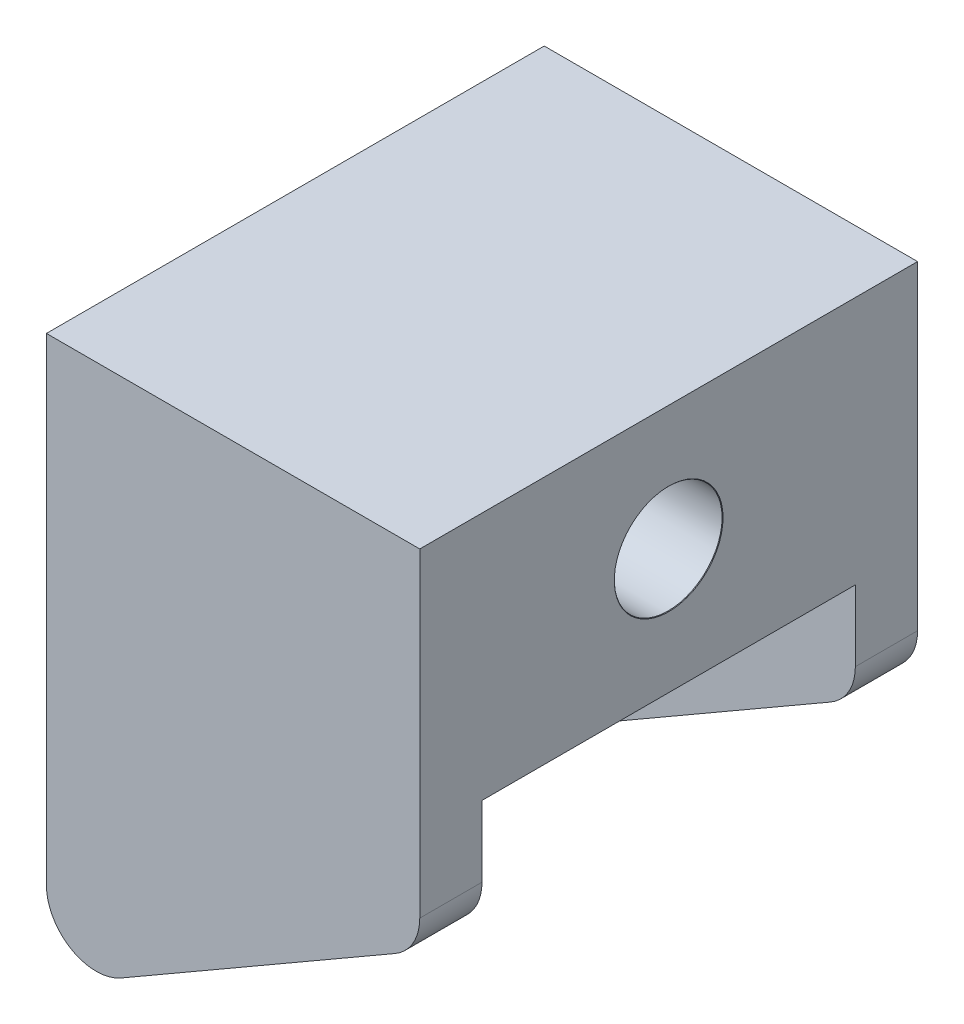
ISO-10303-21;
HEADER;
FILE_DESCRIPTION(('STEP AP214'),'2;1');
FILE_NAME('part.step','',(''),(''),'','','');
FILE_SCHEMA(('AUTOMOTIVE_DESIGN { 1 0 10303 214 1 1 1 1 }'));
ENDSEC;
DATA;
#1=APPLICATION_CONTEXT('core data for automotive mechanical design processes');
#2=APPLICATION_PROTOCOL_DEFINITION('international standard','automotive_design',2000,#1);
#3=PRODUCT_CONTEXT('',#1,'mechanical');
#4=PRODUCT('Part','Part','',(#3));
#5=PRODUCT_RELATED_PRODUCT_CATEGORY('part','',(#4));
#6=PRODUCT_DEFINITION_FORMATION('','',#4);
#7=PRODUCT_DEFINITION_CONTEXT('part definition',#1,'design');
#8=PRODUCT_DEFINITION('design','',#6,#7);
#9=PRODUCT_DEFINITION_SHAPE('','',#8);
#10=(LENGTH_UNIT() NAMED_UNIT(*) SI_UNIT(.MILLI.,.METRE.));
#11=(NAMED_UNIT(*) PLANE_ANGLE_UNIT() SI_UNIT($,.RADIAN.));
#12=(NAMED_UNIT(*) SI_UNIT($,.STERADIAN.) SOLID_ANGLE_UNIT());
#13=UNCERTAINTY_MEASURE_WITH_UNIT(LENGTH_MEASURE(1.E-05),#10,'distance_accuracy_value','');
#14=(GEOMETRIC_REPRESENTATION_CONTEXT(3) GLOBAL_UNCERTAINTY_ASSIGNED_CONTEXT((#13)) GLOBAL_UNIT_ASSIGNED_CONTEXT((#10,
#11,#12)) REPRESENTATION_CONTEXT('',''));
#15=CARTESIAN_POINT('',(0.,0.,0.));
#16=DIRECTION('',(0.,0.,1.));
#17=DIRECTION('',(1.,0.,0.));
#18=AXIS2_PLACEMENT_3D('',#15,#16,#17);
#19=CARTESIAN_POINT('',(45.085,-15.875,0.));
#20=DIRECTION('',(1.,0.,0.));
#21=DIRECTION('',(0.,0.,-1.));
#22=AXIS2_PLACEMENT_3D('',#19,#20,#21);
#23=CYLINDRICAL_SURFACE('',#22,2.74999999999998);
#24=CARTESIAN_POINT('',(45.06,-15.875,0.));
#25=DIRECTION('',(1.,0.,0.));
#26=DIRECTION('',(0.,0.,-1.));
#27=AXIS2_PLACEMENT_3D('',#24,#25,#26);
#28=CIRCLE('',#27,2.74999999999999);
#29=CARTESIAN_POINT('',(45.06,-15.875,-2.74999999999999));
#30=VERTEX_POINT('',#29);
#31=EDGE_CURVE('E293',#30,#30,#28,.T.);
#32=ORIENTED_EDGE('',*,*,#31,.T.);
#33=EDGE_LOOP('',(#32));
#34=FACE_BOUND('',#33,.T.);
#35=CARTESIAN_POINT('',(36.035,-15.875,0.));
#36=DIRECTION('',(-1.,0.,0.));
#37=DIRECTION('',(0.,-1.,0.));
#38=AXIS2_PLACEMENT_3D('',#35,#36,#37);
#39=CIRCLE('',#38,2.74999999999998);
#40=CARTESIAN_POINT('',(36.035,-18.625,0.));
#41=VERTEX_POINT('',#40);
#42=EDGE_CURVE('E239',#41,#41,#39,.F.);
#43=ORIENTED_EDGE('',*,*,#42,.F.);
#44=EDGE_LOOP('',(#43));
#45=FACE_BOUND('',#44,.T.);
#46=ADVANCED_FACE('F47',(#34,#45),#23,.F.);
#47=CARTESIAN_POINT('',(26.035,-33.2235226280624,12.7));
#48=DIRECTION('',(-0.500000000000001,0.866025403784438,0.));
#49=DIRECTION('',(-0.866025403784438,-0.500000000000001,0.));
#50=AXIS2_PLACEMENT_3D('',#47,#48,#49);
#51=PLANE('',#50);
#52=DIRECTION('',(0.866025403784438,0.500000000000001,0.));
#53=VECTOR('',#52,1.);
#54=CARTESIAN_POINT('',(26.035,-33.2235226280624,9.525));
#55=LINE('',#54,#53);
#56=CARTESIAN_POINT('',(26.035,-33.2235226280624,9.525));
#57=VERTEX_POINT('',#56);
#58=CARTESIAN_POINT('',(45.085,-22.225,9.525));
#59=VERTEX_POINT('',#58);
#60=EDGE_CURVE('E258',#57,#59,#55,.T.);
#61=ORIENTED_EDGE('',*,*,#60,.F.);
#62=DIRECTION('',(0.,0.,-1.));
#63=VECTOR('',#62,1.);
#64=CARTESIAN_POINT('',(26.035,-33.2235226280624,12.7));
#65=LINE('',#64,#63);
#66=CARTESIAN_POINT('',(26.035,-33.2235226280624,-9.525));
#67=VERTEX_POINT('',#66);
#68=EDGE_CURVE('E329',#57,#67,#65,.T.);
#69=ORIENTED_EDGE('',*,*,#68,.T.);
#70=DIRECTION('',(0.866025403784438,0.500000000000001,0.));
#71=VECTOR('',#70,1.);
#72=CARTESIAN_POINT('',(26.035,-33.2235226280624,-9.525));
#73=LINE('',#72,#71);
#74=CARTESIAN_POINT('',(45.085,-22.225,-9.525));
#75=VERTEX_POINT('',#74);
#76=EDGE_CURVE('E271',#67,#75,#73,.T.);
#77=ORIENTED_EDGE('',*,*,#76,.T.);
#78=DIRECTION('',(0.,0.,-1.));
#79=VECTOR('',#78,1.);
#80=CARTESIAN_POINT('',(45.085,-22.225,12.7));
#81=LINE('',#80,#79);
#82=EDGE_CURVE('E325',#59,#75,#81,.T.);
#83=ORIENTED_EDGE('',*,*,#82,.F.);
#84=EDGE_LOOP('',(#61,#69,#77,#83));
#85=FACE_BOUND('',#84,.T.);
#86=ADVANCED_FACE('F464',(#85),#51,.F.);
#87=CARTESIAN_POINT('',(26.035,-9.525,12.7));
#88=DIRECTION('',(1.,0.,0.));
#89=DIRECTION('',(0.,1.,0.));
#90=AXIS2_PLACEMENT_3D('',#87,#88,#89);
#91=PLANE('',#90);
#92=DIRECTION('',(0.,0.,-1.));
#93=VECTOR('',#92,1.);
#94=CARTESIAN_POINT('',(26.035,-10.825,12.7));
#95=LINE('',#94,#93);
#96=CARTESIAN_POINT('',(26.035,-10.825,-2.91561885940761));
#97=VERTEX_POINT('',#96);
#98=CARTESIAN_POINT('',(26.035,-10.825,2.91561885940761));
#99=VERTEX_POINT('',#98);
#100=EDGE_CURVE('E390',#97,#99,#95,.F.);
#101=ORIENTED_EDGE('',*,*,#100,.T.);
#102=DIRECTION('',(0.,0.866025403784439,-0.5));
#103=VECTOR('',#102,1.);
#104=CARTESIAN_POINT('',(26.035,-14.0867613140312,4.79879763209582));
#105=LINE('',#104,#103);
#106=CARTESIAN_POINT('',(26.035,-15.875,5.83123771881522));
#107=VERTEX_POINT('',#106);
#108=EDGE_CURVE('E405',#99,#107,#105,.F.);
#109=ORIENTED_EDGE('',*,*,#108,.T.);
#110=DIRECTION('',(0.,0.866025403784439,0.5));
#111=VECTOR('',#110,1.);
#112=CARTESIAN_POINT('',(26.035,-8.13823868596882,10.298058946127));
#113=LINE('',#112,#111);
#114=CARTESIAN_POINT('',(26.035,-20.925,2.91561885940761));
#115=VERTEX_POINT('',#114);
#116=EDGE_CURVE('E402',#107,#115,#113,.F.);
#117=ORIENTED_EDGE('',*,*,#116,.T.);
#118=DIRECTION('',(0.,0.,1.));
#119=VECTOR('',#118,1.);
#120=CARTESIAN_POINT('',(26.035,-20.925,12.7));
#121=LINE('',#120,#119);
#122=CARTESIAN_POINT('',(26.035,-20.925,-2.91561885940761));
#123=VERTEX_POINT('',#122);
#124=EDGE_CURVE('E399',#115,#123,#121,.F.);
#125=ORIENTED_EDGE('',*,*,#124,.T.);
#126=DIRECTION('',(0.,-0.866025403784439,0.5));
#127=VECTOR('',#126,1.);
#128=CARTESIAN_POINT('',(26.035,-19.1367613140312,-3.94805894612701));
#129=LINE('',#128,#127);
#130=CARTESIAN_POINT('',(26.035,-15.875,-5.83123771881522));
#131=VERTEX_POINT('',#130);
#132=EDGE_CURVE('E396',#123,#131,#129,.F.);
#133=ORIENTED_EDGE('',*,*,#132,.T.);
#134=DIRECTION('',(0.,-0.866025403784439,-0.5));
#135=VECTOR('',#134,1.);
#136=CARTESIAN_POINT('',(26.035,-3.08823868596882,1.55120236790418));
#137=LINE('',#136,#135);
#138=EDGE_CURVE('E393',#131,#97,#137,.F.);
#139=ORIENTED_EDGE('',*,*,#138,.T.);
#140=EDGE_LOOP('',(#101,#109,#117,#125,#133,#139));
#141=FACE_BOUND('',#140,.T.);
#142=DIRECTION('',(0.,-1.,0.));
#143=VECTOR('',#142,1.);
#144=CARTESIAN_POINT('',(26.035,-9.525,-12.7));
#145=LINE('',#144,#143);
#146=CARTESIAN_POINT('',(26.035,-9.525,-12.7));
#147=VERTEX_POINT('',#146);
#148=CARTESIAN_POINT('',(26.035,-33.9041135768375,-12.7));
#149=VERTEX_POINT('',#148);
#150=EDGE_CURVE('E297',#147,#149,#145,.T.);
#151=ORIENTED_EDGE('',*,*,#150,.T.);
#152=DIRECTION('',(0.,0.,1.));
#153=VECTOR('',#152,1.);
#154=CARTESIAN_POINT('',(26.035,-33.9041135768375,12.7));
#155=LINE('',#154,#153);
#156=CARTESIAN_POINT('',(26.035,-33.9041135768375,-9.525));
#157=VERTEX_POINT('',#156);
#158=EDGE_CURVE('E381',#149,#157,#155,.T.);
#159=ORIENTED_EDGE('',*,*,#158,.T.);
#160=DIRECTION('',(0.,1.,0.));
#161=VECTOR('',#160,1.);
#162=CARTESIAN_POINT('',(26.035,-38.3035226280624,-9.525));
#163=LINE('',#162,#161);
#164=EDGE_CURVE('E280',#157,#67,#163,.T.);
#165=ORIENTED_EDGE('',*,*,#164,.T.);
#166=ORIENTED_EDGE('',*,*,#68,.F.);
#167=DIRECTION('',(0.,1.,0.));
#168=VECTOR('',#167,1.);
#169=CARTESIAN_POINT('',(26.035,-38.3035226280624,9.525));
#170=LINE('',#169,#168);
#171=CARTESIAN_POINT('',(26.035,-33.9041135768375,9.525));
#172=VERTEX_POINT('',#171);
#173=EDGE_CURVE('E268',#172,#57,#170,.T.);
#174=ORIENTED_EDGE('',*,*,#173,.F.);
#175=DIRECTION('',(0.,0.,-1.));
#176=VECTOR('',#175,1.);
#177=CARTESIAN_POINT('',(26.035,-33.9041135768375,12.7));
#178=LINE('',#177,#176);
#179=CARTESIAN_POINT('',(26.035,-33.9041135768375,12.7));
#180=VERTEX_POINT('',#179);
#181=EDGE_CURVE('E378',#172,#180,#178,.F.);
#182=ORIENTED_EDGE('',*,*,#181,.T.);
#183=DIRECTION('',(0.,-1.,0.));
#184=VECTOR('',#183,1.);
#185=CARTESIAN_POINT('',(26.035,-9.525,12.7));
#186=LINE('',#185,#184);
#187=CARTESIAN_POINT('',(26.035,-9.525,12.7));
#188=VERTEX_POINT('',#187);
#189=EDGE_CURVE('E298',#188,#180,#186,.T.);
#190=ORIENTED_EDGE('',*,*,#189,.F.);
#191=DIRECTION('',(0.,0.,-1.));
#192=VECTOR('',#191,1.);
#193=CARTESIAN_POINT('',(26.035,-9.525,12.7));
#194=LINE('',#193,#192);
#195=EDGE_CURVE('E309',#188,#147,#194,.T.);
#196=ORIENTED_EDGE('',*,*,#195,.T.);
#197=EDGE_LOOP('',(#151,#159,#165,#166,#174,#182,#190,#196));
#198=FACE_BOUND('',#197,.T.);
#199=ADVANCED_FACE('F471',(#141,#198),#91,.F.);
#200=CARTESIAN_POINT('',(45.085,-22.225,12.7));
#201=DIRECTION('',(-1.,0.,0.));
#202=DIRECTION('',(0.,0.,1.));
#203=AXIS2_PLACEMENT_3D('',#200,#201,#202);
#204=PLANE('',#203);
#205=CARTESIAN_POINT('',(45.085,-15.875,0.));
#206=DIRECTION('',(1.,0.,0.));
#207=DIRECTION('',(0.,0.,-1.));
#208=AXIS2_PLACEMENT_3D('',#205,#206,#207);
#209=CIRCLE('',#208,2.775);
#210=CARTESIAN_POINT('',(45.085,-15.875,-2.775));
#211=VERTEX_POINT('',#210);
#212=EDGE_CURVE('E287',#211,#211,#209,.T.);
#213=ORIENTED_EDGE('',*,*,#212,.F.);
#214=EDGE_LOOP('',(#213));
#215=FACE_BOUND('',#214,.T.);
#216=DIRECTION('',(0.,1.,0.));
#217=VECTOR('',#216,1.);
#218=CARTESIAN_POINT('',(45.085,-22.225,12.7));
#219=LINE('',#218,#217);
#220=CARTESIAN_POINT('',(45.085,-25.8385303162584,12.7));
#221=VERTEX_POINT('',#220);
#222=CARTESIAN_POINT('',(45.085,-9.525,12.7));
#223=VERTEX_POINT('',#222);
#224=EDGE_CURVE('E302',#221,#223,#219,.T.);
#225=ORIENTED_EDGE('',*,*,#224,.F.);
#226=DIRECTION('',(0.,0.,1.));
#227=VECTOR('',#226,1.);
#228=CARTESIAN_POINT('',(45.085,-25.8385303162584,9.525));
#229=LINE('',#228,#227);
#230=CARTESIAN_POINT('',(45.085,-25.8385303162584,9.525));
#231=VERTEX_POINT('',#230);
#232=EDGE_CURVE('E351',#221,#231,#229,.F.);
#233=ORIENTED_EDGE('',*,*,#232,.T.);
#234=DIRECTION('',(0.,1.,0.));
#235=VECTOR('',#234,1.);
#236=CARTESIAN_POINT('',(45.085,-27.305,9.525));
#237=LINE('',#236,#235);
#238=EDGE_CURVE('E262',#231,#59,#237,.T.);
#239=ORIENTED_EDGE('',*,*,#238,.T.);
#240=ORIENTED_EDGE('',*,*,#82,.T.);
#241=DIRECTION('',(0.,1.,0.));
#242=VECTOR('',#241,1.);
#243=CARTESIAN_POINT('',(45.085,-27.305,-9.525));
#244=LINE('',#243,#242);
#245=CARTESIAN_POINT('',(45.085,-25.8385303162584,-9.525));
#246=VERTEX_POINT('',#245);
#247=EDGE_CURVE('E284',#246,#75,#244,.T.);
#248=ORIENTED_EDGE('',*,*,#247,.F.);
#249=DIRECTION('',(0.,0.,-1.));
#250=VECTOR('',#249,1.);
#251=CARTESIAN_POINT('',(45.085,-25.8385303162584,12.7));
#252=LINE('',#251,#250);
#253=CARTESIAN_POINT('',(45.085,-25.8385303162584,-12.7));
#254=VERTEX_POINT('',#253);
#255=EDGE_CURVE('E347',#246,#254,#252,.T.);
#256=ORIENTED_EDGE('',*,*,#255,.T.);
#257=DIRECTION('',(0.,1.,0.));
#258=VECTOR('',#257,1.);
#259=CARTESIAN_POINT('',(45.085,-22.225,-12.7));
#260=LINE('',#259,#258);
#261=CARTESIAN_POINT('',(45.085,-9.525,-12.7));
#262=VERTEX_POINT('',#261);
#263=EDGE_CURVE('E313',#254,#262,#260,.T.);
#264=ORIENTED_EDGE('',*,*,#263,.T.);
#265=DIRECTION('',(0.,0.,-1.));
#266=VECTOR('',#265,1.);
#267=CARTESIAN_POINT('',(45.085,-9.525,12.7));
#268=LINE('',#267,#266);
#269=EDGE_CURVE('E321',#223,#262,#268,.T.);
#270=ORIENTED_EDGE('',*,*,#269,.F.);
#271=EDGE_LOOP('',(#225,#233,#239,#240,#248,#256,#264,#270));
#272=FACE_BOUND('',#271,.T.);
#273=ADVANCED_FACE('F490',(#215,#272),#204,.F.);
#274=CARTESIAN_POINT('',(45.085,-9.525,12.7));
#275=DIRECTION('',(0.,-1.,0.));
#276=DIRECTION('',(0.,0.,-1.));
#277=AXIS2_PLACEMENT_3D('',#274,#275,#276);
#278=PLANE('',#277);
#279=DIRECTION('',(-1.,0.,0.));
#280=VECTOR('',#279,1.);
#281=CARTESIAN_POINT('',(45.085,-9.525,-12.7));
#282=LINE('',#281,#280);
#283=EDGE_CURVE('E303',#262,#147,#282,.T.);
#284=ORIENTED_EDGE('',*,*,#283,.T.);
#285=ORIENTED_EDGE('',*,*,#195,.F.);
#286=DIRECTION('',(-1.,0.,0.));
#287=VECTOR('',#286,1.);
#288=CARTESIAN_POINT('',(45.085,-9.525,12.7));
#289=LINE('',#288,#287);
#290=EDGE_CURVE('E306',#223,#188,#289,.T.);
#291=ORIENTED_EDGE('',*,*,#290,.F.);
#292=ORIENTED_EDGE('',*,*,#269,.T.);
#293=EDGE_LOOP('',(#284,#285,#291,#292));
#294=FACE_BOUND('',#293,.T.);
#295=ADVANCED_FACE('F483',(#294),#278,.F.);
#296=CARTESIAN_POINT('',(0.,0.,12.7));
#297=DIRECTION('',(0.,0.,-1.));
#298=DIRECTION('',(-1.,0.,0.));
#299=AXIS2_PLACEMENT_3D('',#296,#297,#298);
#300=PLANE('',#299);
#301=DIRECTION('',(-0.866025403784438,-0.500000000000001,0.));
#302=VECTOR('',#301,1.);
#303=CARTESIAN_POINT('',(26.035,-38.3035226280624,12.7));
#304=LINE('',#303,#302);
#305=CARTESIAN_POINT('',(43.815,-28.0382348418708,12.7));
#306=VERTEX_POINT('',#305);
#307=CARTESIAN_POINT('',(29.845,-36.1038181024499,12.7));
#308=VERTEX_POINT('',#307);
#309=EDGE_CURVE('E253',#306,#308,#304,.T.);
#310=ORIENTED_EDGE('',*,*,#309,.F.);
#311=CARTESIAN_POINT('',(42.545,-25.8385303162584,12.7));
#312=DIRECTION('',(0.,0.,-1.));
#313=DIRECTION('',(-1.,0.,0.));
#314=AXIS2_PLACEMENT_3D('',#311,#312,#313);
#315=CIRCLE('',#314,2.54);
#316=EDGE_CURVE('E344',#306,#221,#315,.F.);
#317=ORIENTED_EDGE('',*,*,#316,.T.);
#318=ORIENTED_EDGE('',*,*,#224,.T.);
#319=ORIENTED_EDGE('',*,*,#290,.T.);
#320=ORIENTED_EDGE('',*,*,#189,.T.);
#321=CARTESIAN_POINT('',(28.575,-33.9041135768375,12.7));
#322=DIRECTION('',(0.,0.,-1.));
#323=DIRECTION('',(-1.,0.,0.));
#324=AXIS2_PLACEMENT_3D('',#321,#322,#323);
#325=CIRCLE('',#324,2.54);
#326=EDGE_CURVE('E341',#180,#308,#325,.F.);
#327=ORIENTED_EDGE('',*,*,#326,.T.);
#328=EDGE_LOOP('',(#310,#317,#318,#319,#320,#327));
#329=FACE_BOUND('',#328,.T.);
#330=ADVANCED_FACE('F479',(#329),#300,.F.);
#331=CARTESIAN_POINT('',(0.,0.,-12.7));
#332=DIRECTION('',(0.,0.,-1.));
#333=DIRECTION('',(-1.,0.,0.));
#334=AXIS2_PLACEMENT_3D('',#331,#332,#333);
#335=PLANE('',#334);
#336=ORIENTED_EDGE('',*,*,#263,.F.);
#337=CARTESIAN_POINT('',(42.545,-25.8385303162584,-12.7));
#338=DIRECTION('',(0.,0.,-1.));
#339=DIRECTION('',(-1.,0.,0.));
#340=AXIS2_PLACEMENT_3D('',#337,#338,#339);
#341=CIRCLE('',#340,2.54);
#342=CARTESIAN_POINT('',(43.815,-28.0382348418708,-12.7));
#343=VERTEX_POINT('',#342);
#344=EDGE_CURVE('E363',#254,#343,#341,.T.);
#345=ORIENTED_EDGE('',*,*,#344,.T.);
#346=DIRECTION('',(-0.866025403784438,-0.500000000000001,0.));
#347=VECTOR('',#346,1.);
#348=CARTESIAN_POINT('',(26.035,-38.3035226280624,-12.7));
#349=LINE('',#348,#347);
#350=CARTESIAN_POINT('',(29.845,-36.1038181024499,-12.7));
#351=VERTEX_POINT('',#350);
#352=EDGE_CURVE('E272',#343,#351,#349,.T.);
#353=ORIENTED_EDGE('',*,*,#352,.T.);
#354=CARTESIAN_POINT('',(28.575,-33.9041135768375,-12.7));
#355=DIRECTION('',(0.,0.,-1.));
#356=DIRECTION('',(-1.,0.,0.));
#357=AXIS2_PLACEMENT_3D('',#354,#355,#356);
#358=CIRCLE('',#357,2.54);
#359=EDGE_CURVE('E360',#351,#149,#358,.T.);
#360=ORIENTED_EDGE('',*,*,#359,.T.);
#361=ORIENTED_EDGE('',*,*,#150,.F.);
#362=ORIENTED_EDGE('',*,*,#283,.F.);
#363=EDGE_LOOP('',(#336,#345,#353,#360,#361,#362));
#364=FACE_BOUND('',#363,.T.);
#365=ADVANCED_FACE('F482',(#364),#335,.T.);
#366=CARTESIAN_POINT('',(45.085,-15.875,0.));
#367=DIRECTION('',(1.,0.,0.));
#368=DIRECTION('',(0.,0.,-1.));
#369=AXIS2_PLACEMENT_3D('',#366,#367,#368);
#370=CONICAL_SURFACE('',#369,2.775,0.785398163397448);
#371=ORIENTED_EDGE('',*,*,#31,.F.);
#372=EDGE_LOOP('',(#371));
#373=FACE_BOUND('',#372,.T.);
#374=ORIENTED_EDGE('',*,*,#212,.T.);
#375=EDGE_LOOP('',(#374));
#376=FACE_BOUND('',#375,.T.);
#377=ADVANCED_FACE('F477',(#373,#376),#370,.F.);
#378=CARTESIAN_POINT('',(26.035,-38.3035226280624,-9.525));
#379=DIRECTION('',(0.,0.,1.));
#380=DIRECTION('',(1.,0.,0.));
#381=AXIS2_PLACEMENT_3D('',#378,#379,#380);
#382=PLANE('',#381);
#383=DIRECTION('',(0.866025403784438,0.500000000000001,0.));
#384=VECTOR('',#383,1.);
#385=CARTESIAN_POINT('',(26.035,-38.3035226280624,-9.525));
#386=LINE('',#385,#384);
#387=CARTESIAN_POINT('',(29.845,-36.1038181024499,-9.525));
#388=VERTEX_POINT('',#387);
#389=CARTESIAN_POINT('',(43.815,-28.0382348418708,-9.525));
#390=VERTEX_POINT('',#389);
#391=EDGE_CURVE('E276',#388,#390,#386,.T.);
#392=ORIENTED_EDGE('',*,*,#391,.T.);
#393=CARTESIAN_POINT('',(42.545,-25.8385303162584,-9.525));
#394=DIRECTION('',(0.,0.,1.));
#395=DIRECTION('',(1.,0.,0.));
#396=AXIS2_PLACEMENT_3D('',#393,#394,#395);
#397=CIRCLE('',#396,2.54);
#398=EDGE_CURVE('E375',#390,#246,#397,.T.);
#399=ORIENTED_EDGE('',*,*,#398,.T.);
#400=ORIENTED_EDGE('',*,*,#247,.T.);
#401=ORIENTED_EDGE('',*,*,#76,.F.);
#402=ORIENTED_EDGE('',*,*,#164,.F.);
#403=CARTESIAN_POINT('',(28.575,-33.9041135768375,-9.525));
#404=DIRECTION('',(0.,0.,1.));
#405=DIRECTION('',(1.,0.,0.));
#406=AXIS2_PLACEMENT_3D('',#403,#404,#405);
#407=CIRCLE('',#406,2.54);
#408=EDGE_CURVE('E372',#157,#388,#407,.T.);
#409=ORIENTED_EDGE('',*,*,#408,.T.);
#410=EDGE_LOOP('',(#392,#399,#400,#401,#402,#409));
#411=FACE_BOUND('',#410,.T.);
#412=ADVANCED_FACE('F698',(#411),#382,.T.);
#413=CARTESIAN_POINT('',(20.8949572995546,-41.2711276648107,0.));
#414=DIRECTION('',(-0.500000000000001,0.866025403784438,0.));
#415=DIRECTION('',(-0.866025403784438,-0.500000000000001,0.));
#416=AXIS2_PLACEMENT_3D('',#413,#414,#415);
#417=PLANE('',#416);
#418=ORIENTED_EDGE('',*,*,#352,.F.);
#419=DIRECTION('',(0.,0.,-1.));
#420=VECTOR('',#419,1.);
#421=CARTESIAN_POINT('',(43.815,-28.0382348418708,0.));
#422=LINE('',#421,#420);
#423=EDGE_CURVE('E369',#343,#390,#422,.F.);
#424=ORIENTED_EDGE('',*,*,#423,.T.);
#425=ORIENTED_EDGE('',*,*,#391,.F.);
#426=DIRECTION('',(0.,0.,1.));
#427=VECTOR('',#426,1.);
#428=CARTESIAN_POINT('',(29.845,-36.1038181024499,0.));
#429=LINE('',#428,#427);
#430=EDGE_CURVE('E366',#388,#351,#429,.F.);
#431=ORIENTED_EDGE('',*,*,#430,.T.);
#432=EDGE_LOOP('',(#418,#424,#425,#431));
#433=FACE_BOUND('',#432,.T.);
#434=ADVANCED_FACE('F711',(#433),#417,.F.);
#435=CARTESIAN_POINT('',(26.035,-38.3035226280624,9.525));
#436=DIRECTION('',(0.,0.,1.));
#437=DIRECTION('',(1.,0.,0.));
#438=AXIS2_PLACEMENT_3D('',#435,#436,#437);
#439=PLANE('',#438);
#440=ORIENTED_EDGE('',*,*,#238,.F.);
#441=CARTESIAN_POINT('',(42.545,-25.8385303162584,9.525));
#442=DIRECTION('',(0.,0.,1.));
#443=DIRECTION('',(1.,0.,0.));
#444=AXIS2_PLACEMENT_3D('',#441,#442,#443);
#445=CIRCLE('',#444,2.54);
#446=CARTESIAN_POINT('',(43.815,-28.0382348418708,9.525));
#447=VERTEX_POINT('',#446);
#448=EDGE_CURVE('E357',#231,#447,#445,.F.);
#449=ORIENTED_EDGE('',*,*,#448,.T.);
#450=DIRECTION('',(0.866025403784438,0.500000000000001,0.));
#451=VECTOR('',#450,1.);
#452=CARTESIAN_POINT('',(26.035,-38.3035226280624,9.525));
#453=LINE('',#452,#451);
#454=CARTESIAN_POINT('',(29.845,-36.1038181024499,9.525));
#455=VERTEX_POINT('',#454);
#456=EDGE_CURVE('E257',#455,#447,#453,.T.);
#457=ORIENTED_EDGE('',*,*,#456,.F.);
#458=CARTESIAN_POINT('',(28.575,-33.9041135768375,9.525));
#459=DIRECTION('',(0.,0.,1.));
#460=DIRECTION('',(1.,0.,0.));
#461=AXIS2_PLACEMENT_3D('',#458,#459,#460);
#462=CIRCLE('',#461,2.54);
#463=EDGE_CURVE('E354',#455,#172,#462,.F.);
#464=ORIENTED_EDGE('',*,*,#463,.T.);
#465=ORIENTED_EDGE('',*,*,#173,.T.);
#466=ORIENTED_EDGE('',*,*,#60,.T.);
#467=EDGE_LOOP('',(#440,#449,#457,#464,#465,#466));
#468=FACE_BOUND('',#467,.T.);
#469=ADVANCED_FACE('F719',(#468),#439,.F.);
#470=CARTESIAN_POINT('',(20.8949572995546,-41.2711276648107,0.));
#471=DIRECTION('',(0.500000000000001,-0.866025403784438,0.));
#472=DIRECTION('',(0.866025403784438,0.500000000000001,0.));
#473=AXIS2_PLACEMENT_3D('',#470,#471,#472);
#474=PLANE('',#473);
#475=ORIENTED_EDGE('',*,*,#456,.T.);
#476=DIRECTION('',(0.,0.,1.));
#477=VECTOR('',#476,1.);
#478=CARTESIAN_POINT('',(43.815,-28.0382348418708,12.7));
#479=LINE('',#478,#477);
#480=EDGE_CURVE('E337',#447,#306,#479,.T.);
#481=ORIENTED_EDGE('',*,*,#480,.T.);
#482=ORIENTED_EDGE('',*,*,#309,.T.);
#483=DIRECTION('',(0.,0.,-1.));
#484=VECTOR('',#483,1.);
#485=CARTESIAN_POINT('',(29.845,-36.1038181024499,9.525));
#486=LINE('',#485,#484);
#487=EDGE_CURVE('E333',#308,#455,#486,.T.);
#488=ORIENTED_EDGE('',*,*,#487,.T.);
#489=EDGE_LOOP('',(#475,#481,#482,#488));
#490=FACE_BOUND('',#489,.T.);
#491=ADVANCED_FACE('F502',(#490),#474,.T.);
#492=CARTESIAN_POINT('',(42.545,-25.8385303162584,0.));
#493=DIRECTION('',(0.,0.,-1.));
#494=DIRECTION('',(-1.,0.,0.));
#495=AXIS2_PLACEMENT_3D('',#492,#493,#494);
#496=CYLINDRICAL_SURFACE('',#495,2.54);
#497=ORIENTED_EDGE('',*,*,#448,.F.);
#498=ORIENTED_EDGE('',*,*,#232,.F.);
#499=ORIENTED_EDGE('',*,*,#316,.F.);
#500=ORIENTED_EDGE('',*,*,#480,.F.);
#501=EDGE_LOOP('',(#497,#498,#499,#500));
#502=FACE_BOUND('',#501,.T.);
#503=ADVANCED_FACE('F498',(#502),#496,.T.);
#504=CARTESIAN_POINT('',(42.545,-25.8385303162584,12.7));
#505=DIRECTION('',(0.,0.,-1.));
#506=DIRECTION('',(-1.,0.,0.));
#507=AXIS2_PLACEMENT_3D('',#504,#505,#506);
#508=CYLINDRICAL_SURFACE('',#507,2.54);
#509=ORIENTED_EDGE('',*,*,#398,.F.);
#510=ORIENTED_EDGE('',*,*,#423,.F.);
#511=ORIENTED_EDGE('',*,*,#344,.F.);
#512=ORIENTED_EDGE('',*,*,#255,.F.);
#513=EDGE_LOOP('',(#509,#510,#511,#512));
#514=FACE_BOUND('',#513,.T.);
#515=ADVANCED_FACE('F501',(#514),#508,.T.);
#516=CARTESIAN_POINT('',(28.575,-33.9041135768375,12.7));
#517=DIRECTION('',(0.,0.,1.));
#518=DIRECTION('',(1.,0.,0.));
#519=AXIS2_PLACEMENT_3D('',#516,#517,#518);
#520=CYLINDRICAL_SURFACE('',#519,2.54);
#521=ORIENTED_EDGE('',*,*,#359,.F.);
#522=ORIENTED_EDGE('',*,*,#430,.F.);
#523=ORIENTED_EDGE('',*,*,#408,.F.);
#524=ORIENTED_EDGE('',*,*,#158,.F.);
#525=EDGE_LOOP('',(#521,#522,#523,#524));
#526=FACE_BOUND('',#525,.T.);
#527=ADVANCED_FACE('F506',(#526),#520,.T.);
#528=CARTESIAN_POINT('',(28.575,-33.9041135768375,0.));
#529=DIRECTION('',(0.,0.,1.));
#530=DIRECTION('',(1.,0.,0.));
#531=AXIS2_PLACEMENT_3D('',#528,#529,#530);
#532=CYLINDRICAL_SURFACE('',#531,2.54);
#533=ORIENTED_EDGE('',*,*,#326,.F.);
#534=ORIENTED_EDGE('',*,*,#181,.F.);
#535=ORIENTED_EDGE('',*,*,#463,.F.);
#536=ORIENTED_EDGE('',*,*,#487,.F.);
#537=EDGE_LOOP('',(#533,#534,#535,#536));
#538=FACE_BOUND('',#537,.T.);
#539=ADVANCED_FACE('F510',(#538),#532,.T.);
#540=CARTESIAN_POINT('',(36.035,0.,0.));
#541=DIRECTION('',(-1.,0.,0.));
#542=DIRECTION('',(0.,-1.,0.));
#543=AXIS2_PLACEMENT_3D('',#540,#541,#542);
#544=PLANE('',#543);
#545=DIRECTION('',(0.,0.866025403784439,-0.5));
#546=VECTOR('',#545,1.);
#547=CARTESIAN_POINT('',(36.035,-14.5867613140312,3.93277222831139));
#548=LINE('',#547,#546);
#549=CARTESIAN_POINT('',(36.035,-15.875,4.67653718043597));
#550=VERTEX_POINT('',#549);
#551=CARTESIAN_POINT('',(36.035,-11.825,2.33826859021799));
#552=VERTEX_POINT('',#551);
#553=EDGE_CURVE('E196',#550,#552,#548,.T.);
#554=ORIENTED_EDGE('',*,*,#553,.T.);
#555=DIRECTION('',(0.,0.,-1.));
#556=VECTOR('',#555,1.);
#557=CARTESIAN_POINT('',(36.035,-11.825,12.7));
#558=LINE('',#557,#556);
#559=CARTESIAN_POINT('',(36.035,-11.825,-2.33826859021798));
#560=VERTEX_POINT('',#559);
#561=EDGE_CURVE('E205',#552,#560,#558,.T.);
#562=ORIENTED_EDGE('',*,*,#561,.T.);
#563=DIRECTION('',(0.,-0.866025403784439,-0.5));
#564=VECTOR('',#563,1.);
#565=CARTESIAN_POINT('',(36.035,-3.58823868596882,2.41722777168861));
#566=LINE('',#565,#564);
#567=CARTESIAN_POINT('',(36.035,-15.875,-4.67653718043597));
#568=VERTEX_POINT('',#567);
#569=EDGE_CURVE('E211',#560,#568,#566,.T.);
#570=ORIENTED_EDGE('',*,*,#569,.T.);
#571=DIRECTION('',(0.,-0.866025403784439,0.5));
#572=VECTOR('',#571,1.);
#573=CARTESIAN_POINT('',(36.035,-18.6367613140312,-3.08203354234257));
#574=LINE('',#573,#572);
#575=CARTESIAN_POINT('',(36.035,-19.925,-2.33826859021798));
#576=VERTEX_POINT('',#575);
#577=EDGE_CURVE('E227',#568,#576,#574,.T.);
#578=ORIENTED_EDGE('',*,*,#577,.T.);
#579=DIRECTION('',(0.,0.,1.));
#580=VECTOR('',#579,1.);
#581=CARTESIAN_POINT('',(36.035,-19.925,12.7));
#582=LINE('',#581,#580);
#583=CARTESIAN_POINT('',(36.035,-19.925,2.33826859021799));
#584=VERTEX_POINT('',#583);
#585=EDGE_CURVE('E231',#576,#584,#582,.T.);
#586=ORIENTED_EDGE('',*,*,#585,.T.);
#587=DIRECTION('',(0.,0.866025403784439,0.5));
#588=VECTOR('',#587,1.);
#589=CARTESIAN_POINT('',(36.035,-7.63823868596882,9.43203354234257));
#590=LINE('',#589,#588);
#591=EDGE_CURVE('E202',#584,#550,#590,.T.);
#592=ORIENTED_EDGE('',*,*,#591,.T.);
#593=EDGE_LOOP('',(#554,#562,#570,#578,#586,#592));
#594=FACE_BOUND('',#593,.T.);
#595=ORIENTED_EDGE('',*,*,#42,.T.);
#596=EDGE_LOOP('',(#595));
#597=FACE_BOUND('',#596,.T.);
#598=ADVANCED_FACE('F213',(#594,#597),#544,.T.);
#599=CARTESIAN_POINT('',(36.035,-14.5867613140312,3.93277222831139));
#600=DIRECTION('',(0.,0.5,0.866025403784439));
#601=DIRECTION('',(0.,-0.866025403784439,0.5));
#602=AXIS2_PLACEMENT_3D('',#599,#600,#601);
#603=PLANE('',#602);
#604=DIRECTION('',(-1.,0.,0.));
#605=VECTOR('',#604,1.);
#606=CARTESIAN_POINT('',(36.035,-15.875,4.67653718043597));
#607=LINE('',#606,#605);
#608=CARTESIAN_POINT('',(27.035,-15.875,4.67653718043597));
#609=VERTEX_POINT('',#608);
#610=EDGE_CURVE('E236',#550,#609,#607,.T.);
#611=ORIENTED_EDGE('',*,*,#610,.T.);
#612=DIRECTION('',(0.,0.866025403784439,-0.5));
#613=VECTOR('',#612,1.);
#614=CARTESIAN_POINT('',(27.035,-14.5867613140312,3.93277222831139));
#615=LINE('',#614,#613);
#616=CARTESIAN_POINT('',(27.035,-11.825,2.33826859021799));
#617=VERTEX_POINT('',#616);
#618=EDGE_CURVE('E199',#609,#617,#615,.T.);
#619=ORIENTED_EDGE('',*,*,#618,.T.);
#620=DIRECTION('',(-1.,0.,0.));
#621=VECTOR('',#620,1.);
#622=CARTESIAN_POINT('',(36.035,-11.825,2.33826859021799));
#623=LINE('',#622,#621);
#624=EDGE_CURVE('E191',#552,#617,#623,.T.);
#625=ORIENTED_EDGE('',*,*,#624,.F.);
#626=ORIENTED_EDGE('',*,*,#553,.F.);
#627=EDGE_LOOP('',(#611,#619,#625,#626));
#628=FACE_BOUND('',#627,.T.);
#629=ADVANCED_FACE('F194',(#628),#603,.F.);
#630=CARTESIAN_POINT('',(36.035,-7.63823868596882,9.43203354234257));
#631=DIRECTION('',(0.,-0.5,0.866025403784439));
#632=DIRECTION('',(0.,-0.866025403784439,-0.5));
#633=AXIS2_PLACEMENT_3D('',#630,#631,#632);
#634=PLANE('',#633);
#635=DIRECTION('',(-1.,0.,0.));
#636=VECTOR('',#635,1.);
#637=CARTESIAN_POINT('',(36.035,-19.925,2.33826859021799));
#638=LINE('',#637,#636);
#639=CARTESIAN_POINT('',(27.035,-19.925,2.33826859021799));
#640=VERTEX_POINT('',#639);
#641=EDGE_CURVE('E240',#584,#640,#638,.T.);
#642=ORIENTED_EDGE('',*,*,#641,.T.);
#643=DIRECTION('',(0.,0.866025403784439,0.5));
#644=VECTOR('',#643,1.);
#645=CARTESIAN_POINT('',(27.035,-7.63823868596882,9.43203354234257));
#646=LINE('',#645,#644);
#647=EDGE_CURVE('E409',#640,#609,#646,.T.);
#648=ORIENTED_EDGE('',*,*,#647,.T.);
#649=ORIENTED_EDGE('',*,*,#610,.F.);
#650=ORIENTED_EDGE('',*,*,#591,.F.);
#651=EDGE_LOOP('',(#642,#648,#649,#650));
#652=FACE_BOUND('',#651,.T.);
#653=ADVANCED_FACE('F541',(#652),#634,.F.);
#654=CARTESIAN_POINT('',(36.035,-19.925,12.7));
#655=DIRECTION('',(0.,-1.,0.));
#656=DIRECTION('',(0.,0.,-1.));
#657=AXIS2_PLACEMENT_3D('',#654,#655,#656);
#658=PLANE('',#657);
#659=DIRECTION('',(-1.,0.,0.));
#660=VECTOR('',#659,1.);
#661=CARTESIAN_POINT('',(36.035,-19.925,-2.33826859021798));
#662=LINE('',#661,#660);
#663=CARTESIAN_POINT('',(27.035,-19.925,-2.33826859021798));
#664=VERTEX_POINT('',#663);
#665=EDGE_CURVE('E244',#576,#664,#662,.T.);
#666=ORIENTED_EDGE('',*,*,#665,.T.);
#667=DIRECTION('',(0.,0.,1.));
#668=VECTOR('',#667,1.);
#669=CARTESIAN_POINT('',(27.035,-19.925,12.7));
#670=LINE('',#669,#668);
#671=EDGE_CURVE('E412',#664,#640,#670,.T.);
#672=ORIENTED_EDGE('',*,*,#671,.T.);
#673=ORIENTED_EDGE('',*,*,#641,.F.);
#674=ORIENTED_EDGE('',*,*,#585,.F.);
#675=EDGE_LOOP('',(#666,#672,#673,#674));
#676=FACE_BOUND('',#675,.T.);
#677=ADVANCED_FACE('F452',(#676),#658,.F.);
#678=CARTESIAN_POINT('',(36.035,-18.6367613140312,-3.08203354234257));
#679=DIRECTION('',(0.,-0.5,-0.866025403784439));
#680=DIRECTION('',(0.,0.866025403784439,-0.5));
#681=AXIS2_PLACEMENT_3D('',#678,#679,#680);
#682=PLANE('',#681);
#683=DIRECTION('',(-1.,0.,0.));
#684=VECTOR('',#683,1.);
#685=CARTESIAN_POINT('',(36.035,-15.875,-4.67653718043597));
#686=LINE('',#685,#684);
#687=CARTESIAN_POINT('',(27.035,-15.875,-4.67653718043597));
#688=VERTEX_POINT('',#687);
#689=EDGE_CURVE('E248',#568,#688,#686,.T.);
#690=ORIENTED_EDGE('',*,*,#689,.T.);
#691=DIRECTION('',(0.,-0.866025403784439,0.5));
#692=VECTOR('',#691,1.);
#693=CARTESIAN_POINT('',(27.035,-18.6367613140312,-3.08203354234257));
#694=LINE('',#693,#692);
#695=EDGE_CURVE('E415',#688,#664,#694,.T.);
#696=ORIENTED_EDGE('',*,*,#695,.T.);
#697=ORIENTED_EDGE('',*,*,#665,.F.);
#698=ORIENTED_EDGE('',*,*,#577,.F.);
#699=EDGE_LOOP('',(#690,#696,#697,#698));
#700=FACE_BOUND('',#699,.T.);
#701=ADVANCED_FACE('F448',(#700),#682,.F.);
#702=CARTESIAN_POINT('',(36.035,-3.58823868596882,2.41722777168861));
#703=DIRECTION('',(0.,0.5,-0.866025403784439));
#704=DIRECTION('',(0.,0.866025403784439,0.5));
#705=AXIS2_PLACEMENT_3D('',#702,#703,#704);
#706=PLANE('',#705);
#707=DIRECTION('',(-1.,0.,0.));
#708=VECTOR('',#707,1.);
#709=CARTESIAN_POINT('',(36.035,-11.825,-2.33826859021798));
#710=LINE('',#709,#708);
#711=CARTESIAN_POINT('',(27.035,-11.825,-2.33826859021798));
#712=VERTEX_POINT('',#711);
#713=EDGE_CURVE('E201',#560,#712,#710,.T.);
#714=ORIENTED_EDGE('',*,*,#713,.T.);
#715=DIRECTION('',(0.,-0.866025403784439,-0.5));
#716=VECTOR('',#715,1.);
#717=CARTESIAN_POINT('',(27.035,-3.58823868596882,2.41722777168861));
#718=LINE('',#717,#716);
#719=EDGE_CURVE('E57',#712,#688,#718,.T.);
#720=ORIENTED_EDGE('',*,*,#719,.T.);
#721=ORIENTED_EDGE('',*,*,#689,.F.);
#722=ORIENTED_EDGE('',*,*,#569,.F.);
#723=EDGE_LOOP('',(#714,#720,#721,#722));
#724=FACE_BOUND('',#723,.T.);
#725=ADVANCED_FACE('F453',(#724),#706,.F.);
#726=CARTESIAN_POINT('',(36.035,-11.825,12.7));
#727=DIRECTION('',(0.,1.,0.));
#728=DIRECTION('',(0.,0.,1.));
#729=AXIS2_PLACEMENT_3D('',#726,#727,#728);
#730=PLANE('',#729);
#731=ORIENTED_EDGE('',*,*,#624,.T.);
#732=DIRECTION('',(0.,0.,-1.));
#733=VECTOR('',#732,1.);
#734=CARTESIAN_POINT('',(27.035,-11.825,12.7));
#735=LINE('',#734,#733);
#736=EDGE_CURVE('E11',#617,#712,#735,.T.);
#737=ORIENTED_EDGE('',*,*,#736,.T.);
#738=ORIENTED_EDGE('',*,*,#713,.F.);
#739=ORIENTED_EDGE('',*,*,#561,.F.);
#740=EDGE_LOOP('',(#731,#737,#738,#739));
#741=FACE_BOUND('',#740,.T.);
#742=ADVANCED_FACE('F206',(#741),#730,.F.);
#743=CARTESIAN_POINT('',(27.035,-19.1367613140312,-3.94805894612701));
#744=DIRECTION('',(0.,-0.866025403784439,0.5));
#745=DIRECTION('',(0.,-0.5,-0.866025403784439));
#746=AXIS2_PLACEMENT_3D('',#743,#744,#745);
#747=CYLINDRICAL_SURFACE('',#746,1.);
#748=CARTESIAN_POINT('',(27.035,-15.875,-5.83123771881522));
#749=DIRECTION('',(0.,-1.,0.));
#750=DIRECTION('',(0.,0.,1.));
#751=AXIS2_PLACEMENT_3D('',#748,#749,#750);
#752=ELLIPSE('',#751,1.15470053837925,1.);
#753=EDGE_CURVE('E223',#131,#688,#752,.F.);
#754=ORIENTED_EDGE('',*,*,#753,.F.);
#755=ORIENTED_EDGE('',*,*,#132,.F.);
#756=CARTESIAN_POINT('',(27.035,-20.925,-2.91561885940761));
#757=DIRECTION('',(0.,-0.5,0.866025403784439));
#758=DIRECTION('',(0.,0.866025403784439,0.5));
#759=AXIS2_PLACEMENT_3D('',#756,#757,#758);
#760=ELLIPSE('',#759,1.15470053837925,1.);
#761=EDGE_CURVE('E51',#664,#123,#760,.T.);
#762=ORIENTED_EDGE('',*,*,#761,.F.);
#763=ORIENTED_EDGE('',*,*,#695,.F.);
#764=EDGE_LOOP('',(#754,#755,#762,#763));
#765=FACE_BOUND('',#764,.T.);
#766=ADVANCED_FACE('F49',(#765),#747,.T.);
#767=CARTESIAN_POINT('',(27.035,-20.925,12.7));
#768=DIRECTION('',(0.,0.,1.));
#769=DIRECTION('',(1.,0.,0.));
#770=AXIS2_PLACEMENT_3D('',#767,#768,#769);
#771=CYLINDRICAL_SURFACE('',#770,1.);
#772=ORIENTED_EDGE('',*,*,#761,.T.);
#773=ORIENTED_EDGE('',*,*,#124,.F.);
#774=CARTESIAN_POINT('',(27.035,-20.925,2.91561885940761));
#775=DIRECTION('',(0.,0.5,0.866025403784439));
#776=DIRECTION('',(0.,0.866025403784439,-0.5));
#777=AXIS2_PLACEMENT_3D('',#774,#775,#776);
#778=ELLIPSE('',#777,1.15470053837925,1.);
#779=EDGE_CURVE('E430',#640,#115,#778,.T.);
#780=ORIENTED_EDGE('',*,*,#779,.F.);
#781=ORIENTED_EDGE('',*,*,#671,.F.);
#782=EDGE_LOOP('',(#772,#773,#780,#781));
#783=FACE_BOUND('',#782,.T.);
#784=ADVANCED_FACE('F528',(#783),#771,.T.);
#785=CARTESIAN_POINT('',(27.035,-3.08823868596882,1.55120236790418));
#786=DIRECTION('',(0.,-0.866025403784439,-0.5));
#787=DIRECTION('',(0.,0.5,-0.866025403784439));
#788=AXIS2_PLACEMENT_3D('',#785,#786,#787);
#789=CYLINDRICAL_SURFACE('',#788,1.);
#790=ORIENTED_EDGE('',*,*,#753,.T.);
#791=ORIENTED_EDGE('',*,*,#719,.F.);
#792=CARTESIAN_POINT('',(27.035,-10.825,-2.91561885940761));
#793=DIRECTION('',(0.,-0.5,-0.866025403784439));
#794=DIRECTION('',(0.,-0.866025403784439,0.5));
#795=AXIS2_PLACEMENT_3D('',#792,#793,#794);
#796=ELLIPSE('',#795,1.15470053837925,1.);
#797=EDGE_CURVE('E426',#97,#712,#796,.F.);
#798=ORIENTED_EDGE('',*,*,#797,.F.);
#799=ORIENTED_EDGE('',*,*,#138,.F.);
#800=EDGE_LOOP('',(#790,#791,#798,#799));
#801=FACE_BOUND('',#800,.T.);
#802=ADVANCED_FACE('F440',(#801),#789,.T.);
#803=CARTESIAN_POINT('',(27.035,-8.13823868596882,10.298058946127));
#804=DIRECTION('',(0.,0.866025403784439,0.5));
#805=DIRECTION('',(0.,-0.5,0.866025403784439));
#806=AXIS2_PLACEMENT_3D('',#803,#804,#805);
#807=CYLINDRICAL_SURFACE('',#806,1.);
#808=ORIENTED_EDGE('',*,*,#779,.T.);
#809=ORIENTED_EDGE('',*,*,#116,.F.);
#810=CARTESIAN_POINT('',(27.035,-15.875,5.83123771881522));
#811=DIRECTION('',(0.,1.,0.));
#812=DIRECTION('',(0.,0.,-1.));
#813=AXIS2_PLACEMENT_3D('',#810,#811,#812);
#814=ELLIPSE('',#813,1.15470053837925,1.);
#815=EDGE_CURVE('E423',#609,#107,#814,.T.);
#816=ORIENTED_EDGE('',*,*,#815,.F.);
#817=ORIENTED_EDGE('',*,*,#647,.F.);
#818=EDGE_LOOP('',(#808,#809,#816,#817));
#819=FACE_BOUND('',#818,.T.);
#820=ADVANCED_FACE('F522',(#819),#807,.T.);
#821=CARTESIAN_POINT('',(27.035,-10.825,12.7));
#822=DIRECTION('',(0.,0.,-1.));
#823=DIRECTION('',(-1.,0.,0.));
#824=AXIS2_PLACEMENT_3D('',#821,#822,#823);
#825=CYLINDRICAL_SURFACE('',#824,1.);
#826=ORIENTED_EDGE('',*,*,#797,.T.);
#827=ORIENTED_EDGE('',*,*,#736,.F.);
#828=CARTESIAN_POINT('',(27.035,-10.825,2.91561885940761));
#829=DIRECTION('',(0.,0.5,-0.866025403784439));
#830=DIRECTION('',(0.,0.866025403784439,0.5));
#831=AXIS2_PLACEMENT_3D('',#828,#829,#830);
#832=ELLIPSE('',#831,1.15470053837925,1.);
#833=EDGE_CURVE('E420',#99,#617,#832,.F.);
#834=ORIENTED_EDGE('',*,*,#833,.F.);
#835=ORIENTED_EDGE('',*,*,#100,.F.);
#836=EDGE_LOOP('',(#826,#827,#834,#835));
#837=FACE_BOUND('',#836,.T.);
#838=ADVANCED_FACE('F518',(#837),#825,.T.);
#839=CARTESIAN_POINT('',(27.035,-14.0867613140312,4.79879763209583));
#840=DIRECTION('',(0.,0.866025403784439,-0.5));
#841=DIRECTION('',(0.,0.5,0.866025403784439));
#842=AXIS2_PLACEMENT_3D('',#839,#840,#841);
#843=CYLINDRICAL_SURFACE('',#842,1.);
#844=ORIENTED_EDGE('',*,*,#815,.T.);
#845=ORIENTED_EDGE('',*,*,#108,.F.);
#846=ORIENTED_EDGE('',*,*,#833,.T.);
#847=ORIENTED_EDGE('',*,*,#618,.F.);
#848=EDGE_LOOP('',(#844,#845,#846,#847));
#849=FACE_BOUND('',#848,.T.);
#850=ADVANCED_FACE('F515',(#849),#843,.T.);
#851=CLOSED_SHELL('',(#46,#86,#199,#273,#295,#330,#365,#377,#412,#434,#469,#491,#503,#515,#527,
#539,#598,#629,#653,#677,#701,#725,#742,#766,#784,#802,#820,#838,#850));
#852=MANIFOLD_SOLID_BREP('B2',#851);
#853=ADVANCED_BREP_SHAPE_REPRESENTATION('',(#18,#852),#14);
#854=SHAPE_DEFINITION_REPRESENTATION(#9,#853);
ENDSEC;
END-ISO-10303-21;
